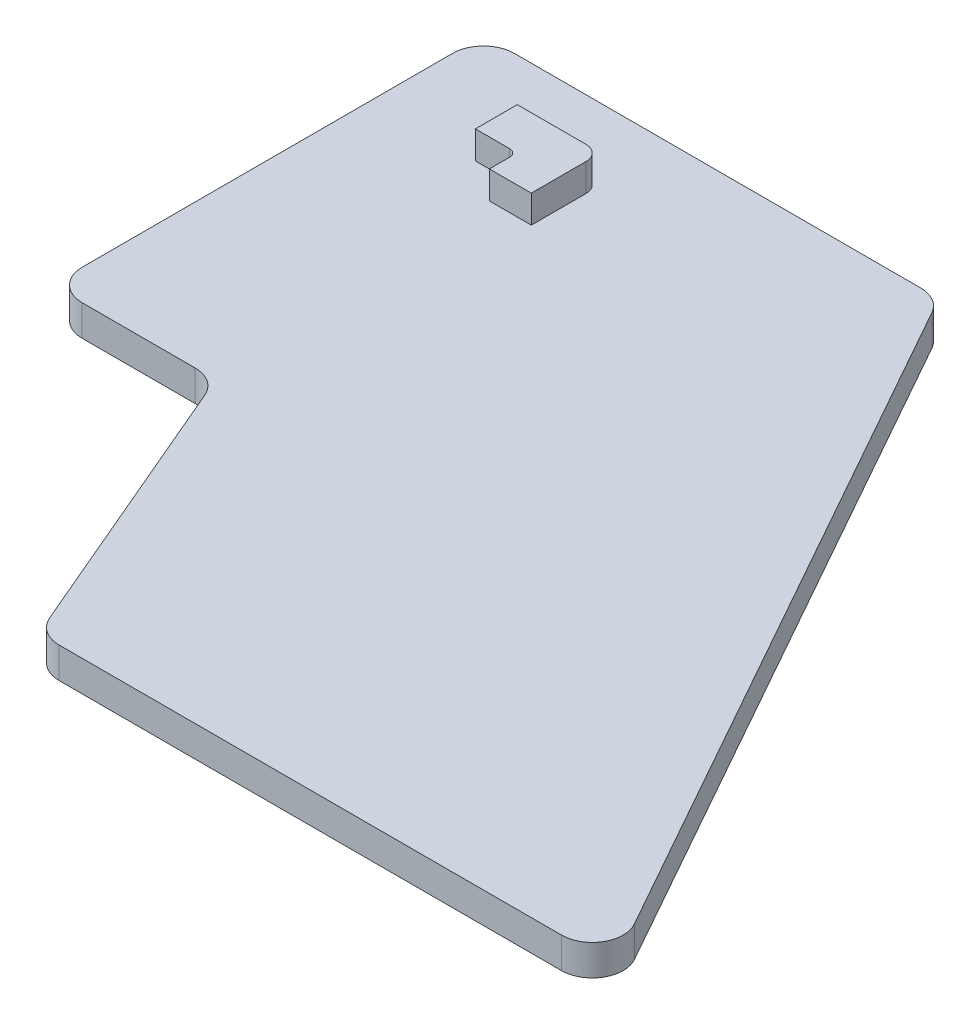
ISO-10303-21;
HEADER;
FILE_DESCRIPTION(('STEP AP214'),'2;1');
FILE_NAME('part.step','',(''),(''),'','','');
FILE_SCHEMA(('AUTOMOTIVE_DESIGN { 1 0 10303 214 1 1 1 1 }'));
ENDSEC;
DATA;
#1=APPLICATION_CONTEXT('core data for automotive mechanical design processes');
#2=APPLICATION_PROTOCOL_DEFINITION('international standard','automotive_design',2000,#1);
#3=PRODUCT_CONTEXT('',#1,'mechanical');
#4=PRODUCT('Part','Part','',(#3));
#5=PRODUCT_RELATED_PRODUCT_CATEGORY('part','',(#4));
#6=PRODUCT_DEFINITION_FORMATION('','',#4);
#7=PRODUCT_DEFINITION_CONTEXT('part definition',#1,'design');
#8=PRODUCT_DEFINITION('design','',#6,#7);
#9=PRODUCT_DEFINITION_SHAPE('','',#8);
#10=(LENGTH_UNIT() NAMED_UNIT(*) SI_UNIT(.MILLI.,.METRE.));
#11=(NAMED_UNIT(*) PLANE_ANGLE_UNIT() SI_UNIT($,.RADIAN.));
#12=(NAMED_UNIT(*) SI_UNIT($,.STERADIAN.) SOLID_ANGLE_UNIT());
#13=UNCERTAINTY_MEASURE_WITH_UNIT(LENGTH_MEASURE(1.E-05),#10,'distance_accuracy_value','');
#14=(GEOMETRIC_REPRESENTATION_CONTEXT(3) GLOBAL_UNCERTAINTY_ASSIGNED_CONTEXT((#13)) GLOBAL_UNIT_ASSIGNED_CONTEXT((#10,
#11,#12)) REPRESENTATION_CONTEXT('',''));
#15=CARTESIAN_POINT('',(0.,0.,0.));
#16=DIRECTION('',(0.,0.,1.));
#17=DIRECTION('',(1.,0.,0.));
#18=AXIS2_PLACEMENT_3D('',#15,#16,#17);
#19=CARTESIAN_POINT('',(45.0474985018765,0.,-41.3328587699317));
#20=DIRECTION('',(0.,-1.,0.));
#21=DIRECTION('',(0.,0.,-1.));
#22=AXIS2_PLACEMENT_3D('',#19,#20,#21);
#23=PLANE('',#22);
#24=CARTESIAN_POINT('',(45.0474985018765,0.,-41.3328587699317));
#25=DIRECTION('',(0.,1.,0.));
#26=DIRECTION('',(0.,0.,-1.));
#27=AXIS2_PLACEMENT_3D('',#24,#25,#26);
#28=CIRCLE('',#27,3.175);
#29=CARTESIAN_POINT('',(47.8161807801542,0.,-42.8868933390295));
#30=VERTEX_POINT('',#29);
#31=CARTESIAN_POINT('',(45.0474985018765,0.,-44.5078587699317));
#32=VERTEX_POINT('',#31);
#33=EDGE_CURVE('E185',#30,#32,#28,.T.);
#34=ORIENTED_EDGE('',*,*,#33,.T.);
#35=DIRECTION('',(-1.,0.,0.));
#36=VECTOR('',#35,1.);
#37=CARTESIAN_POINT('',(3.17500000000002,0.,-44.5078587699317));
#38=LINE('',#37,#36);
#39=CARTESIAN_POINT('',(3.17500000000002,0.,-44.5078587699317));
#40=VERTEX_POINT('',#39);
#41=EDGE_CURVE('E188',#32,#40,#38,.T.);
#42=ORIENTED_EDGE('',*,*,#41,.T.);
#43=CARTESIAN_POINT('',(3.175,0.,-41.3328587699317));
#44=DIRECTION('',(0.,1.,0.));
#45=DIRECTION('',(0.,0.,1.));
#46=AXIS2_PLACEMENT_3D('',#43,#44,#45);
#47=CIRCLE('',#46,3.175);
#48=CARTESIAN_POINT('',(0.,0.,-41.3328587699316));
#49=VERTEX_POINT('',#48);
#50=EDGE_CURVE('E234',#40,#49,#47,.T.);
#51=ORIENTED_EDGE('',*,*,#50,.T.);
#52=DIRECTION('',(0.,0.,1.));
#53=VECTOR('',#52,1.);
#54=CARTESIAN_POINT('',(0.,0.,-3.17500000000002));
#55=LINE('',#54,#53);
#56=CARTESIAN_POINT('',(0.,0.,-3.17500000000002));
#57=VERTEX_POINT('',#56);
#58=EDGE_CURVE('E237',#49,#57,#55,.T.);
#59=ORIENTED_EDGE('',*,*,#58,.T.);
#60=CARTESIAN_POINT('',(3.175,0.,-3.175));
#61=DIRECTION('',(0.,1.,0.));
#62=DIRECTION('',(0.,0.,-1.));
#63=AXIS2_PLACEMENT_3D('',#60,#61,#62);
#64=CIRCLE('',#63,3.175);
#65=CARTESIAN_POINT('',(3.17500000000002,0.,0.));
#66=VERTEX_POINT('',#65);
#67=EDGE_CURVE('E240',#57,#66,#64,.T.);
#68=ORIENTED_EDGE('',*,*,#67,.T.);
#69=DIRECTION('',(1.,0.,0.));
#70=VECTOR('',#69,1.);
#71=CARTESIAN_POINT('',(14.8087254781073,0.,0.));
#72=LINE('',#71,#70);
#73=CARTESIAN_POINT('',(14.8087254781073,0.,0.));
#74=VERTEX_POINT('',#73);
#75=EDGE_CURVE('E243',#66,#74,#72,.T.);
#76=ORIENTED_EDGE('',*,*,#75,.T.);
#77=CARTESIAN_POINT('',(14.8087254781073,0.,3.175));
#78=DIRECTION('',(0.,-1.,0.));
#79=DIRECTION('',(0.,0.,1.));
#80=AXIS2_PLACEMENT_3D('',#77,#78,#79);
#81=CIRCLE('',#80,3.175);
#82=CARTESIAN_POINT('',(17.7293479504936,0.,1.92977336448649));
#83=VERTEX_POINT('',#82);
#84=EDGE_CURVE('E246',#74,#83,#81,.T.);
#85=ORIENTED_EDGE('',*,*,#84,.T.);
#86=DIRECTION('',(0.39219736551607,0.,0.919881093664966));
#87=VECTOR('',#86,1.);
#88=CARTESIAN_POINT('',(29.6082922430003,0.,29.7912972505477));
#89=LINE('',#88,#87);
#90=CARTESIAN_POINT('',(29.6082922430003,0.,29.7912972505477));
#91=VERTEX_POINT('',#90);
#92=EDGE_CURVE('E249',#83,#91,#89,.T.);
#93=ORIENTED_EDGE('',*,*,#92,.T.);
#94=CARTESIAN_POINT('',(32.5289147153866,0.,28.5460706150342));
#95=DIRECTION('',(0.,1.,0.));
#96=DIRECTION('',(0.,0.,-1.));
#97=AXIS2_PLACEMENT_3D('',#94,#95,#96);
#98=CIRCLE('',#97,3.175);
#99=CARTESIAN_POINT('',(32.5289147153866,0.,31.7210706150342));
#100=VERTEX_POINT('',#99);
#101=EDGE_CURVE('E252',#91,#100,#98,.T.);
#102=ORIENTED_EDGE('',*,*,#101,.T.);
#103=DIRECTION('',(1.,0.,0.));
#104=VECTOR('',#103,1.);
#105=CARTESIAN_POINT('',(84.2698653179541,0.,31.7210706150342));
#106=LINE('',#105,#104);
#107=CARTESIAN_POINT('',(84.2698653179541,0.,31.7210706150342));
#108=VERTEX_POINT('',#107);
#109=EDGE_CURVE('E255',#100,#108,#106,.T.);
#110=ORIENTED_EDGE('',*,*,#109,.T.);
#111=CARTESIAN_POINT('',(84.2698653179541,0.,28.5460706150342));
#112=DIRECTION('',(0.,1.,0.));
#113=DIRECTION('',(0.,0.,-1.));
#114=AXIS2_PLACEMENT_3D('',#111,#112,#113);
#115=CIRCLE('',#114,3.175);
#116=CARTESIAN_POINT('',(87.0385475962318,0.,26.9920360459363));
#117=VERTEX_POINT('',#116);
#118=EDGE_CURVE('E258',#108,#117,#115,.T.);
#119=ORIENTED_EDGE('',*,*,#118,.T.);
#120=DIRECTION('',(-0.489459706802458,0.,-0.872025914418173));
#121=VECTOR('',#120,1.);
#122=CARTESIAN_POINT('',(47.8161807801542,0.,-42.8868933390295));
#123=LINE('',#122,#121);
#124=EDGE_CURVE('E198',#117,#30,#123,.T.);
#125=ORIENTED_EDGE('',*,*,#124,.T.);
#126=EDGE_LOOP('',(#34,#42,#51,#59,#68,#76,#85,#93,#102,#110,#119,#125));
#127=FACE_BOUND('',#126,.T.);
#128=DIRECTION('',(0.,0.,-1.));
#129=VECTOR('',#128,1.);
#130=CARTESIAN_POINT('',(19.3785254755301,0.,-41.3328587699317));
#131=LINE('',#130,#129);
#132=CARTESIAN_POINT('',(19.3785254755301,0.,-30.0552376996477));
#133=VERTEX_POINT('',#132);
#134=CARTESIAN_POINT('',(19.3785254755301,0.,-35.7010437054775));
#135=VERTEX_POINT('',#134);
#136=EDGE_CURVE('E11',#133,#135,#131,.T.);
#137=ORIENTED_EDGE('',*,*,#136,.F.);
#138=DIRECTION('',(1.,0.,0.));
#139=VECTOR('',#138,1.);
#140=CARTESIAN_POINT('',(45.0474985018765,0.,-30.0552376996477));
#141=LINE('',#140,#139);
#142=CARTESIAN_POINT('',(15.0618146457595,0.,-30.0552376996477));
#143=VERTEX_POINT('',#142);
#144=EDGE_CURVE('E265',#143,#133,#141,.T.);
#145=ORIENTED_EDGE('',*,*,#144,.F.);
#146=DIRECTION('',(0.,0.,1.));
#147=VECTOR('',#146,1.);
#148=CARTESIAN_POINT('',(15.0618146457595,0.,-41.3328587699317));
#149=LINE('',#148,#147);
#150=CARTESIAN_POINT('',(15.0618146457595,0.,-32.1463328757069));
#151=VERTEX_POINT('',#150);
#152=EDGE_CURVE('E289',#151,#143,#149,.T.);
#153=ORIENTED_EDGE('',*,*,#152,.F.);
#154=CARTESIAN_POINT('',(14.2998146457595,0.,-32.1463328757069));
#155=DIRECTION('',(0.,-1.,0.));
#156=DIRECTION('',(0.,0.,-1.));
#157=AXIS2_PLACEMENT_3D('',#154,#155,#156);
#158=CIRCLE('',#157,0.762000000000001);
#159=CARTESIAN_POINT('',(14.2998146457595,0.,-32.9083328757069));
#160=VERTEX_POINT('',#159);
#161=EDGE_CURVE('E292',#160,#151,#158,.T.);
#162=ORIENTED_EDGE('',*,*,#161,.F.);
#163=DIRECTION('',(1.,0.,0.));
#164=VECTOR('',#163,1.);
#165=CARTESIAN_POINT('',(45.0474985018765,0.,-32.9083328757069));
#166=LINE('',#165,#164);
#167=CARTESIAN_POINT('',(10.7687570976498,0.,-32.9083328757069));
#168=VERTEX_POINT('',#167);
#169=EDGE_CURVE('E295',#168,#160,#166,.T.);
#170=ORIENTED_EDGE('',*,*,#169,.F.);
#171=DIRECTION('',(0.,0.,1.));
#172=VECTOR('',#171,1.);
#173=CARTESIAN_POINT('',(10.7687570976498,0.,-41.3328587699317));
#174=LINE('',#173,#172);
#175=CARTESIAN_POINT('',(10.7687570976498,0.,-37.2250437054775));
#176=VERTEX_POINT('',#175);
#177=EDGE_CURVE('E298',#176,#168,#174,.T.);
#178=ORIENTED_EDGE('',*,*,#177,.F.);
#179=DIRECTION('',(-1.,0.,0.));
#180=VECTOR('',#179,1.);
#181=CARTESIAN_POINT('',(45.0474985018765,0.,-37.2250437054775));
#182=LINE('',#181,#180);
#183=CARTESIAN_POINT('',(17.85452547553,0.,-37.2250437054775));
#184=VERTEX_POINT('',#183);
#185=EDGE_CURVE('E49',#184,#176,#182,.T.);
#186=ORIENTED_EDGE('',*,*,#185,.F.);
#187=CARTESIAN_POINT('',(17.8545254755301,0.,-35.7010437054775));
#188=DIRECTION('',(0.,-1.,0.));
#189=DIRECTION('',(0.,0.,-1.));
#190=AXIS2_PLACEMENT_3D('',#187,#188,#189);
#191=CIRCLE('',#190,1.524);
#192=EDGE_CURVE('E39',#135,#184,#191,.F.);
#193=ORIENTED_EDGE('',*,*,#192,.F.);
#194=EDGE_LOOP('',(#137,#145,#153,#162,#170,#178,#186,#193));
#195=FACE_BOUND('',#194,.T.);
#196=ADVANCED_FACE('F31',(#127,#195),#23,.F.);
#197=CARTESIAN_POINT('',(45.0474985018765,-3.175,-41.3328587699317));
#198=DIRECTION('',(0.,1.,0.));
#199=DIRECTION('',(0.,0.,1.));
#200=AXIS2_PLACEMENT_3D('',#197,#198,#199);
#201=CYLINDRICAL_SURFACE('',#200,3.175);
#202=ORIENTED_EDGE('',*,*,#33,.F.);
#203=DIRECTION('',(0.,1.,0.));
#204=VECTOR('',#203,1.);
#205=CARTESIAN_POINT('',(47.8161807801542,-3.175,-42.8868933390295));
#206=LINE('',#205,#204);
#207=CARTESIAN_POINT('',(47.8161807801542,-3.175,-42.8868933390295));
#208=VERTEX_POINT('',#207);
#209=EDGE_CURVE('E263',#208,#30,#206,.T.);
#210=ORIENTED_EDGE('',*,*,#209,.F.);
#211=CARTESIAN_POINT('',(45.0474985018765,-3.175,-41.3328587699317));
#212=DIRECTION('',(0.,1.,0.));
#213=DIRECTION('',(0.,0.,-1.));
#214=AXIS2_PLACEMENT_3D('',#211,#212,#213);
#215=CIRCLE('',#214,3.175);
#216=CARTESIAN_POINT('',(45.0474985018765,-3.175,-44.5078587699317));
#217=VERTEX_POINT('',#216);
#218=EDGE_CURVE('E194',#208,#217,#215,.T.);
#219=ORIENTED_EDGE('',*,*,#218,.T.);
#220=DIRECTION('',(0.,1.,0.));
#221=VECTOR('',#220,1.);
#222=CARTESIAN_POINT('',(45.0474985018765,-3.175,-44.5078587699317));
#223=LINE('',#222,#221);
#224=EDGE_CURVE('E230',#217,#32,#223,.T.);
#225=ORIENTED_EDGE('',*,*,#224,.T.);
#226=EDGE_LOOP('',(#202,#210,#219,#225));
#227=FACE_BOUND('',#226,.T.);
#228=ADVANCED_FACE('F33',(#227),#201,.T.);
#229=CARTESIAN_POINT('',(47.8161807801542,-3.175,-42.8868933390295));
#230=DIRECTION('',(0.872025914418173,0.,-0.489459706802458));
#231=DIRECTION('',(-0.489459706802458,0.,-0.872025914418173));
#232=AXIS2_PLACEMENT_3D('',#229,#230,#231);
#233=PLANE('',#232);
#234=ORIENTED_EDGE('',*,*,#124,.F.);
#235=DIRECTION('',(0.,1.,0.));
#236=VECTOR('',#235,1.);
#237=CARTESIAN_POINT('',(87.0385475962318,-3.175,26.9920360459363));
#238=LINE('',#237,#236);
#239=CARTESIAN_POINT('',(87.0385475962318,-3.175,26.9920360459363));
#240=VERTEX_POINT('',#239);
#241=EDGE_CURVE('E266',#240,#117,#238,.T.);
#242=ORIENTED_EDGE('',*,*,#241,.F.);
#243=DIRECTION('',(-0.489459706802458,0.,-0.872025914418173));
#244=VECTOR('',#243,1.);
#245=CARTESIAN_POINT('',(47.8161807801542,-3.175,-42.8868933390295));
#246=LINE('',#245,#244);
#247=EDGE_CURVE('E228',#240,#208,#246,.T.);
#248=ORIENTED_EDGE('',*,*,#247,.T.);
#249=ORIENTED_EDGE('',*,*,#209,.T.);
#250=EDGE_LOOP('',(#234,#242,#248,#249));
#251=FACE_BOUND('',#250,.T.);
#252=ADVANCED_FACE('F353',(#251),#233,.T.);
#253=CARTESIAN_POINT('',(84.2698653179541,-3.175,28.5460706150342));
#254=DIRECTION('',(0.,1.,0.));
#255=DIRECTION('',(0.,0.,1.));
#256=AXIS2_PLACEMENT_3D('',#253,#254,#255);
#257=CYLINDRICAL_SURFACE('',#256,3.175);
#258=ORIENTED_EDGE('',*,*,#118,.F.);
#259=DIRECTION('',(0.,1.,0.));
#260=VECTOR('',#259,1.);
#261=CARTESIAN_POINT('',(84.2698653179541,-3.175,31.7210706150342));
#262=LINE('',#261,#260);
#263=CARTESIAN_POINT('',(84.2698653179541,-3.175,31.7210706150342));
#264=VERTEX_POINT('',#263);
#265=EDGE_CURVE('E268',#264,#108,#262,.T.);
#266=ORIENTED_EDGE('',*,*,#265,.F.);
#267=CARTESIAN_POINT('',(84.2698653179541,-3.175,28.5460706150342));
#268=DIRECTION('',(0.,1.,0.));
#269=DIRECTION('',(0.,0.,-1.));
#270=AXIS2_PLACEMENT_3D('',#267,#268,#269);
#271=CIRCLE('',#270,3.175);
#272=EDGE_CURVE('E225',#264,#240,#271,.T.);
#273=ORIENTED_EDGE('',*,*,#272,.T.);
#274=ORIENTED_EDGE('',*,*,#241,.T.);
#275=EDGE_LOOP('',(#258,#266,#273,#274));
#276=FACE_BOUND('',#275,.T.);
#277=ADVANCED_FACE('F361',(#276),#257,.T.);
#278=CARTESIAN_POINT('',(84.2698653179541,-3.175,31.7210706150342));
#279=DIRECTION('',(0.,0.,1.));
#280=DIRECTION('',(1.,0.,0.));
#281=AXIS2_PLACEMENT_3D('',#278,#279,#280);
#282=PLANE('',#281);
#283=ORIENTED_EDGE('',*,*,#109,.F.);
#284=DIRECTION('',(0.,1.,0.));
#285=VECTOR('',#284,1.);
#286=CARTESIAN_POINT('',(32.5289147153866,-3.175,31.7210706150342));
#287=LINE('',#286,#285);
#288=CARTESIAN_POINT('',(32.5289147153866,-3.175,31.7210706150342));
#289=VERTEX_POINT('',#288);
#290=EDGE_CURVE('E270',#289,#100,#287,.T.);
#291=ORIENTED_EDGE('',*,*,#290,.F.);
#292=DIRECTION('',(1.,0.,0.));
#293=VECTOR('',#292,1.);
#294=CARTESIAN_POINT('',(84.2698653179541,-3.175,31.7210706150342));
#295=LINE('',#294,#293);
#296=EDGE_CURVE('E222',#289,#264,#295,.T.);
#297=ORIENTED_EDGE('',*,*,#296,.T.);
#298=ORIENTED_EDGE('',*,*,#265,.T.);
#299=EDGE_LOOP('',(#283,#291,#297,#298));
#300=FACE_BOUND('',#299,.T.);
#301=ADVANCED_FACE('F365',(#300),#282,.T.);
#302=CARTESIAN_POINT('',(32.5289147153866,-3.175,28.5460706150342));
#303=DIRECTION('',(0.,1.,0.));
#304=DIRECTION('',(0.,0.,1.));
#305=AXIS2_PLACEMENT_3D('',#302,#303,#304);
#306=CYLINDRICAL_SURFACE('',#305,3.175);
#307=ORIENTED_EDGE('',*,*,#101,.F.);
#308=DIRECTION('',(0.,1.,0.));
#309=VECTOR('',#308,1.);
#310=CARTESIAN_POINT('',(29.6082922430003,-3.175,29.7912972505477));
#311=LINE('',#310,#309);
#312=CARTESIAN_POINT('',(29.6082922430003,-3.175,29.7912972505477));
#313=VERTEX_POINT('',#312);
#314=EDGE_CURVE('E272',#313,#91,#311,.T.);
#315=ORIENTED_EDGE('',*,*,#314,.F.);
#316=CARTESIAN_POINT('',(32.5289147153866,-3.175,28.5460706150342));
#317=DIRECTION('',(0.,1.,0.));
#318=DIRECTION('',(0.,0.,-1.));
#319=AXIS2_PLACEMENT_3D('',#316,#317,#318);
#320=CIRCLE('',#319,3.175);
#321=EDGE_CURVE('E219',#313,#289,#320,.T.);
#322=ORIENTED_EDGE('',*,*,#321,.T.);
#323=ORIENTED_EDGE('',*,*,#290,.T.);
#324=EDGE_LOOP('',(#307,#315,#322,#323));
#325=FACE_BOUND('',#324,.T.);
#326=ADVANCED_FACE('F369',(#325),#306,.T.);
#327=CARTESIAN_POINT('',(29.6082922430003,-3.175,29.7912972505477));
#328=DIRECTION('',(-0.919881093664966,0.,0.39219736551607));
#329=DIRECTION('',(0.39219736551607,0.,0.919881093664966));
#330=AXIS2_PLACEMENT_3D('',#327,#328,#329);
#331=PLANE('',#330);
#332=ORIENTED_EDGE('',*,*,#92,.F.);
#333=DIRECTION('',(0.,1.,0.));
#334=VECTOR('',#333,1.);
#335=CARTESIAN_POINT('',(17.7293479504936,-3.175,1.92977336448649));
#336=LINE('',#335,#334);
#337=CARTESIAN_POINT('',(17.7293479504936,-3.175,1.92977336448649));
#338=VERTEX_POINT('',#337);
#339=EDGE_CURVE('E274',#338,#83,#336,.T.);
#340=ORIENTED_EDGE('',*,*,#339,.F.);
#341=DIRECTION('',(0.39219736551607,0.,0.919881093664966));
#342=VECTOR('',#341,1.);
#343=CARTESIAN_POINT('',(29.6082922430003,-3.175,29.7912972505477));
#344=LINE('',#343,#342);
#345=EDGE_CURVE('E216',#338,#313,#344,.T.);
#346=ORIENTED_EDGE('',*,*,#345,.T.);
#347=ORIENTED_EDGE('',*,*,#314,.T.);
#348=EDGE_LOOP('',(#332,#340,#346,#347));
#349=FACE_BOUND('',#348,.T.);
#350=ADVANCED_FACE('F373',(#349),#331,.T.);
#351=CARTESIAN_POINT('',(14.8087254781073,-3.175,3.175));
#352=DIRECTION('',(0.,1.,0.));
#353=DIRECTION('',(0.,0.,1.));
#354=AXIS2_PLACEMENT_3D('',#351,#352,#353);
#355=CYLINDRICAL_SURFACE('',#354,3.175);
#356=ORIENTED_EDGE('',*,*,#84,.F.);
#357=DIRECTION('',(0.,1.,0.));
#358=VECTOR('',#357,1.);
#359=CARTESIAN_POINT('',(14.8087254781073,-3.175,0.));
#360=LINE('',#359,#358);
#361=CARTESIAN_POINT('',(14.8087254781073,-3.175,0.));
#362=VERTEX_POINT('',#361);
#363=EDGE_CURVE('E276',#362,#74,#360,.T.);
#364=ORIENTED_EDGE('',*,*,#363,.F.);
#365=CARTESIAN_POINT('',(14.8087254781073,-3.175,3.175));
#366=DIRECTION('',(0.,-1.,0.));
#367=DIRECTION('',(0.,0.,1.));
#368=AXIS2_PLACEMENT_3D('',#365,#366,#367);
#369=CIRCLE('',#368,3.175);
#370=EDGE_CURVE('E213',#362,#338,#369,.T.);
#371=ORIENTED_EDGE('',*,*,#370,.T.);
#372=ORIENTED_EDGE('',*,*,#339,.T.);
#373=EDGE_LOOP('',(#356,#364,#371,#372));
#374=FACE_BOUND('',#373,.T.);
#375=ADVANCED_FACE('F377',(#374),#355,.F.);
#376=CARTESIAN_POINT('',(14.8087254781073,-3.175,0.));
#377=DIRECTION('',(0.,0.,1.));
#378=DIRECTION('',(1.,0.,0.));
#379=AXIS2_PLACEMENT_3D('',#376,#377,#378);
#380=PLANE('',#379);
#381=ORIENTED_EDGE('',*,*,#75,.F.);
#382=DIRECTION('',(0.,1.,0.));
#383=VECTOR('',#382,1.);
#384=CARTESIAN_POINT('',(3.17500000000002,-3.175,0.));
#385=LINE('',#384,#383);
#386=CARTESIAN_POINT('',(3.17500000000002,-3.175,0.));
#387=VERTEX_POINT('',#386);
#388=EDGE_CURVE('E278',#387,#66,#385,.T.);
#389=ORIENTED_EDGE('',*,*,#388,.F.);
#390=DIRECTION('',(1.,0.,0.));
#391=VECTOR('',#390,1.);
#392=CARTESIAN_POINT('',(14.8087254781073,-3.175,0.));
#393=LINE('',#392,#391);
#394=EDGE_CURVE('E210',#387,#362,#393,.T.);
#395=ORIENTED_EDGE('',*,*,#394,.T.);
#396=ORIENTED_EDGE('',*,*,#363,.T.);
#397=EDGE_LOOP('',(#381,#389,#395,#396));
#398=FACE_BOUND('',#397,.T.);
#399=ADVANCED_FACE('F381',(#398),#380,.T.);
#400=CARTESIAN_POINT('',(3.175,-3.175,-3.175));
#401=DIRECTION('',(0.,1.,0.));
#402=DIRECTION('',(0.,0.,1.));
#403=AXIS2_PLACEMENT_3D('',#400,#401,#402);
#404=CYLINDRICAL_SURFACE('',#403,3.175);
#405=ORIENTED_EDGE('',*,*,#67,.F.);
#406=DIRECTION('',(0.,1.,0.));
#407=VECTOR('',#406,1.);
#408=CARTESIAN_POINT('',(0.,-3.175,-3.17500000000002));
#409=LINE('',#408,#407);
#410=CARTESIAN_POINT('',(0.,-3.175,-3.17500000000002));
#411=VERTEX_POINT('',#410);
#412=EDGE_CURVE('E280',#411,#57,#409,.T.);
#413=ORIENTED_EDGE('',*,*,#412,.F.);
#414=CARTESIAN_POINT('',(3.175,-3.175,-3.175));
#415=DIRECTION('',(0.,1.,0.));
#416=DIRECTION('',(0.,0.,-1.));
#417=AXIS2_PLACEMENT_3D('',#414,#415,#416);
#418=CIRCLE('',#417,3.175);
#419=EDGE_CURVE('E207',#411,#387,#418,.T.);
#420=ORIENTED_EDGE('',*,*,#419,.T.);
#421=ORIENTED_EDGE('',*,*,#388,.T.);
#422=EDGE_LOOP('',(#405,#413,#420,#421));
#423=FACE_BOUND('',#422,.T.);
#424=ADVANCED_FACE('F385',(#423),#404,.T.);
#425=CARTESIAN_POINT('',(0.,-3.175,-3.17500000000002));
#426=DIRECTION('',(-1.,0.,0.));
#427=DIRECTION('',(0.,0.,1.));
#428=AXIS2_PLACEMENT_3D('',#425,#426,#427);
#429=PLANE('',#428);
#430=ORIENTED_EDGE('',*,*,#58,.F.);
#431=DIRECTION('',(0.,1.,0.));
#432=VECTOR('',#431,1.);
#433=CARTESIAN_POINT('',(0.,-3.175,-41.3328587699316));
#434=LINE('',#433,#432);
#435=CARTESIAN_POINT('',(0.,-3.175,-41.3328587699316));
#436=VERTEX_POINT('',#435);
#437=EDGE_CURVE('E282',#436,#49,#434,.T.);
#438=ORIENTED_EDGE('',*,*,#437,.F.);
#439=DIRECTION('',(0.,0.,1.));
#440=VECTOR('',#439,1.);
#441=CARTESIAN_POINT('',(0.,-3.175,-3.17500000000002));
#442=LINE('',#441,#440);
#443=EDGE_CURVE('E204',#436,#411,#442,.T.);
#444=ORIENTED_EDGE('',*,*,#443,.T.);
#445=ORIENTED_EDGE('',*,*,#412,.T.);
#446=EDGE_LOOP('',(#430,#438,#444,#445));
#447=FACE_BOUND('',#446,.T.);
#448=ADVANCED_FACE('F389',(#447),#429,.T.);
#449=CARTESIAN_POINT('',(3.175,-3.175,-41.3328587699317));
#450=DIRECTION('',(0.,1.,0.));
#451=DIRECTION('',(0.,0.,1.));
#452=AXIS2_PLACEMENT_3D('',#449,#450,#451);
#453=CYLINDRICAL_SURFACE('',#452,3.175);
#454=ORIENTED_EDGE('',*,*,#50,.F.);
#455=DIRECTION('',(0.,1.,0.));
#456=VECTOR('',#455,1.);
#457=CARTESIAN_POINT('',(3.17500000000002,-3.175,-44.5078587699317));
#458=LINE('',#457,#456);
#459=CARTESIAN_POINT('',(3.17500000000002,-3.175,-44.5078587699317));
#460=VERTEX_POINT('',#459);
#461=EDGE_CURVE('E284',#460,#40,#458,.T.);
#462=ORIENTED_EDGE('',*,*,#461,.F.);
#463=CARTESIAN_POINT('',(3.175,-3.175,-41.3328587699317));
#464=DIRECTION('',(0.,1.,0.));
#465=DIRECTION('',(0.,0.,1.));
#466=AXIS2_PLACEMENT_3D('',#463,#464,#465);
#467=CIRCLE('',#466,3.175);
#468=EDGE_CURVE('E201',#460,#436,#467,.T.);
#469=ORIENTED_EDGE('',*,*,#468,.T.);
#470=ORIENTED_EDGE('',*,*,#437,.T.);
#471=EDGE_LOOP('',(#454,#462,#469,#470));
#472=FACE_BOUND('',#471,.T.);
#473=ADVANCED_FACE('F393',(#472),#453,.T.);
#474=CARTESIAN_POINT('',(3.17500000000002,-3.175,-44.5078587699317));
#475=DIRECTION('',(0.,0.,-1.));
#476=DIRECTION('',(-1.,0.,0.));
#477=AXIS2_PLACEMENT_3D('',#474,#475,#476);
#478=PLANE('',#477);
#479=ORIENTED_EDGE('',*,*,#41,.F.);
#480=ORIENTED_EDGE('',*,*,#224,.F.);
#481=DIRECTION('',(-1.,0.,0.));
#482=VECTOR('',#481,1.);
#483=CARTESIAN_POINT('',(3.17500000000002,-3.175,-44.5078587699317));
#484=LINE('',#483,#482);
#485=EDGE_CURVE('E197',#217,#460,#484,.T.);
#486=ORIENTED_EDGE('',*,*,#485,.T.);
#487=ORIENTED_EDGE('',*,*,#461,.T.);
#488=EDGE_LOOP('',(#479,#480,#486,#487));
#489=FACE_BOUND('',#488,.T.);
#490=ADVANCED_FACE('F396',(#489),#478,.T.);
#491=CARTESIAN_POINT('',(45.0474985018765,-3.175,-41.3328587699317));
#492=DIRECTION('',(0.,-1.,0.));
#493=DIRECTION('',(0.,0.,-1.));
#494=AXIS2_PLACEMENT_3D('',#491,#492,#493);
#495=PLANE('',#494);
#496=ORIENTED_EDGE('',*,*,#218,.F.);
#497=ORIENTED_EDGE('',*,*,#247,.F.);
#498=ORIENTED_EDGE('',*,*,#272,.F.);
#499=ORIENTED_EDGE('',*,*,#296,.F.);
#500=ORIENTED_EDGE('',*,*,#321,.F.);
#501=ORIENTED_EDGE('',*,*,#345,.F.);
#502=ORIENTED_EDGE('',*,*,#370,.F.);
#503=ORIENTED_EDGE('',*,*,#394,.F.);
#504=ORIENTED_EDGE('',*,*,#419,.F.);
#505=ORIENTED_EDGE('',*,*,#443,.F.);
#506=ORIENTED_EDGE('',*,*,#468,.F.);
#507=ORIENTED_EDGE('',*,*,#485,.F.);
#508=EDGE_LOOP('',(#496,#497,#498,#499,#500,#501,#502,#503,#504,#505,#506,#507));
#509=FACE_BOUND('',#508,.T.);
#510=ADVANCED_FACE('F357',(#509),#495,.T.);
#511=CARTESIAN_POINT('',(19.3785254755301,2.8575,-35.7010437054775));
#512=DIRECTION('',(-1.,0.,0.));
#513=DIRECTION('',(0.,0.,1.));
#514=AXIS2_PLACEMENT_3D('',#511,#512,#513);
#515=PLANE('',#514);
#516=DIRECTION('',(0.,-1.,0.));
#517=VECTOR('',#516,1.);
#518=CARTESIAN_POINT('',(19.3785254755301,2.8575,-30.0552376996477));
#519=LINE('',#518,#517);
#520=CARTESIAN_POINT('',(19.3785254755301,2.8575,-30.0552376996477));
#521=VERTEX_POINT('',#520);
#522=EDGE_CURVE('E317',#521,#133,#519,.T.);
#523=ORIENTED_EDGE('',*,*,#522,.T.);
#524=ORIENTED_EDGE('',*,*,#136,.T.);
#525=DIRECTION('',(0.,-1.,0.));
#526=VECTOR('',#525,1.);
#527=CARTESIAN_POINT('',(19.3785254755301,2.8575,-35.7010437054775));
#528=LINE('',#527,#526);
#529=CARTESIAN_POINT('',(19.3785254755301,2.8575,-35.7010437054775));
#530=VERTEX_POINT('',#529);
#531=EDGE_CURVE('E168',#530,#135,#528,.T.);
#532=ORIENTED_EDGE('',*,*,#531,.F.);
#533=DIRECTION('',(0.,0.,-1.));
#534=VECTOR('',#533,1.);
#535=CARTESIAN_POINT('',(19.3785254755301,2.8575,-35.7010437054775));
#536=LINE('',#535,#534);
#537=EDGE_CURVE('E174',#521,#530,#536,.T.);
#538=ORIENTED_EDGE('',*,*,#537,.F.);
#539=EDGE_LOOP('',(#523,#524,#532,#538));
#540=FACE_BOUND('',#539,.T.);
#541=ADVANCED_FACE('F184',(#540),#515,.F.);
#542=CARTESIAN_POINT('',(17.8545254755301,2.8575,-35.7010437054775));
#543=DIRECTION('',(0.,-1.,0.));
#544=DIRECTION('',(0.,0.,-1.));
#545=AXIS2_PLACEMENT_3D('',#542,#543,#544);
#546=CYLINDRICAL_SURFACE('',#545,1.524);
#547=ORIENTED_EDGE('',*,*,#531,.T.);
#548=ORIENTED_EDGE('',*,*,#192,.T.);
#549=DIRECTION('',(0.,-1.,0.));
#550=VECTOR('',#549,1.);
#551=CARTESIAN_POINT('',(17.85452547553,2.8575,-37.2250437054775));
#552=LINE('',#551,#550);
#553=CARTESIAN_POINT('',(17.85452547553,2.8575,-37.2250437054775));
#554=VERTEX_POINT('',#553);
#555=EDGE_CURVE('E170',#554,#184,#552,.T.);
#556=ORIENTED_EDGE('',*,*,#555,.F.);
#557=CARTESIAN_POINT('',(17.8545254755301,2.8575,-35.7010437054775));
#558=DIRECTION('',(0.,1.,0.));
#559=DIRECTION('',(0.,0.,-1.));
#560=AXIS2_PLACEMENT_3D('',#557,#558,#559);
#561=CIRCLE('',#560,1.524);
#562=EDGE_CURVE('E164',#530,#554,#561,.T.);
#563=ORIENTED_EDGE('',*,*,#562,.F.);
#564=EDGE_LOOP('',(#547,#548,#556,#563));
#565=FACE_BOUND('',#564,.T.);
#566=ADVANCED_FACE('F166',(#565),#546,.T.);
#567=CARTESIAN_POINT('',(10.7687570976498,2.8575,-37.2250437054775));
#568=DIRECTION('',(0.,0.,1.));
#569=DIRECTION('',(1.,0.,0.));
#570=AXIS2_PLACEMENT_3D('',#567,#568,#569);
#571=PLANE('',#570);
#572=ORIENTED_EDGE('',*,*,#555,.T.);
#573=ORIENTED_EDGE('',*,*,#185,.T.);
#574=DIRECTION('',(0.,-1.,0.));
#575=VECTOR('',#574,1.);
#576=CARTESIAN_POINT('',(10.7687570976498,2.8575,-37.2250437054775));
#577=LINE('',#576,#575);
#578=CARTESIAN_POINT('',(10.7687570976498,2.8575,-37.2250437054775));
#579=VERTEX_POINT('',#578);
#580=EDGE_CURVE('E190',#579,#176,#577,.T.);
#581=ORIENTED_EDGE('',*,*,#580,.F.);
#582=DIRECTION('',(-1.,0.,0.));
#583=VECTOR('',#582,1.);
#584=CARTESIAN_POINT('',(10.7687570976498,2.8575,-37.2250437054775));
#585=LINE('',#584,#583);
#586=EDGE_CURVE('E173',#554,#579,#585,.T.);
#587=ORIENTED_EDGE('',*,*,#586,.F.);
#588=EDGE_LOOP('',(#572,#573,#581,#587));
#589=FACE_BOUND('',#588,.T.);
#590=ADVANCED_FACE('F302',(#589),#571,.F.);
#591=CARTESIAN_POINT('',(10.7687570976498,2.8575,-37.2250437054775));
#592=DIRECTION('',(1.,0.,0.));
#593=DIRECTION('',(0.,0.,-1.));
#594=AXIS2_PLACEMENT_3D('',#591,#592,#593);
#595=PLANE('',#594);
#596=ORIENTED_EDGE('',*,*,#580,.T.);
#597=ORIENTED_EDGE('',*,*,#177,.T.);
#598=DIRECTION('',(0.,-1.,0.));
#599=VECTOR('',#598,1.);
#600=CARTESIAN_POINT('',(10.7687570976498,2.8575,-32.9083328757069));
#601=LINE('',#600,#599);
#602=CARTESIAN_POINT('',(10.7687570976498,2.8575,-32.9083328757069));
#603=VERTEX_POINT('',#602);
#604=EDGE_CURVE('E328',#603,#168,#601,.T.);
#605=ORIENTED_EDGE('',*,*,#604,.F.);
#606=DIRECTION('',(0.,0.,1.));
#607=VECTOR('',#606,1.);
#608=CARTESIAN_POINT('',(10.7687570976498,2.8575,-37.2250437054775));
#609=LINE('',#608,#607);
#610=EDGE_CURVE('E306',#579,#603,#609,.T.);
#611=ORIENTED_EDGE('',*,*,#610,.F.);
#612=EDGE_LOOP('',(#596,#597,#605,#611));
#613=FACE_BOUND('',#612,.T.);
#614=ADVANCED_FACE('F331',(#613),#595,.F.);
#615=CARTESIAN_POINT('',(14.2998146457595,2.8575,-32.9083328757069));
#616=DIRECTION('',(0.,0.,-1.));
#617=DIRECTION('',(-1.,0.,0.));
#618=AXIS2_PLACEMENT_3D('',#615,#616,#617);
#619=PLANE('',#618);
#620=ORIENTED_EDGE('',*,*,#604,.T.);
#621=ORIENTED_EDGE('',*,*,#169,.T.);
#622=DIRECTION('',(0.,-1.,0.));
#623=VECTOR('',#622,1.);
#624=CARTESIAN_POINT('',(14.2998146457595,2.8575,-32.9083328757069));
#625=LINE('',#624,#623);
#626=CARTESIAN_POINT('',(14.2998146457595,2.8575,-32.9083328757069));
#627=VERTEX_POINT('',#626);
#628=EDGE_CURVE('E325',#627,#160,#625,.T.);
#629=ORIENTED_EDGE('',*,*,#628,.F.);
#630=DIRECTION('',(1.,0.,0.));
#631=VECTOR('',#630,1.);
#632=CARTESIAN_POINT('',(14.2998146457595,2.8575,-32.9083328757069));
#633=LINE('',#632,#631);
#634=EDGE_CURVE('E308',#603,#627,#633,.T.);
#635=ORIENTED_EDGE('',*,*,#634,.F.);
#636=EDGE_LOOP('',(#620,#621,#629,#635));
#637=FACE_BOUND('',#636,.T.);
#638=ADVANCED_FACE('F338',(#637),#619,.F.);
#639=CARTESIAN_POINT('',(14.2998146457595,2.8575,-32.1463328757069));
#640=DIRECTION('',(0.,-1.,0.));
#641=DIRECTION('',(0.,0.,-1.));
#642=AXIS2_PLACEMENT_3D('',#639,#640,#641);
#643=CYLINDRICAL_SURFACE('',#642,0.762000000000001);
#644=ORIENTED_EDGE('',*,*,#628,.T.);
#645=ORIENTED_EDGE('',*,*,#161,.T.);
#646=DIRECTION('',(0.,-1.,0.));
#647=VECTOR('',#646,1.);
#648=CARTESIAN_POINT('',(15.0618146457595,2.8575,-32.1463328757069));
#649=LINE('',#648,#647);
#650=CARTESIAN_POINT('',(15.0618146457595,2.8575,-32.1463328757069));
#651=VERTEX_POINT('',#650);
#652=EDGE_CURVE('E322',#651,#151,#649,.T.);
#653=ORIENTED_EDGE('',*,*,#652,.F.);
#654=CARTESIAN_POINT('',(14.2998146457595,2.8575,-32.1463328757069));
#655=DIRECTION('',(0.,-1.,0.));
#656=DIRECTION('',(0.,0.,1.));
#657=AXIS2_PLACEMENT_3D('',#654,#655,#656);
#658=CIRCLE('',#657,0.762000000000001);
#659=EDGE_CURVE('E312',#627,#651,#658,.T.);
#660=ORIENTED_EDGE('',*,*,#659,.F.);
#661=EDGE_LOOP('',(#644,#645,#653,#660));
#662=FACE_BOUND('',#661,.T.);
#663=ADVANCED_FACE('F340',(#662),#643,.F.);
#664=CARTESIAN_POINT('',(15.0618146457595,2.8575,-32.1463328757069));
#665=DIRECTION('',(1.,0.,0.));
#666=DIRECTION('',(0.,0.,-1.));
#667=AXIS2_PLACEMENT_3D('',#664,#665,#666);
#668=PLANE('',#667);
#669=ORIENTED_EDGE('',*,*,#652,.T.);
#670=ORIENTED_EDGE('',*,*,#152,.T.);
#671=DIRECTION('',(0.,-1.,0.));
#672=VECTOR('',#671,1.);
#673=CARTESIAN_POINT('',(15.0618146457595,2.8575,-30.0552376996477));
#674=LINE('',#673,#672);
#675=CARTESIAN_POINT('',(15.0618146457595,2.8575,-30.0552376996477));
#676=VERTEX_POINT('',#675);
#677=EDGE_CURVE('E319',#676,#143,#674,.T.);
#678=ORIENTED_EDGE('',*,*,#677,.F.);
#679=DIRECTION('',(0.,0.,1.));
#680=VECTOR('',#679,1.);
#681=CARTESIAN_POINT('',(15.0618146457595,2.8575,-32.1463328757069));
#682=LINE('',#681,#680);
#683=EDGE_CURVE('E314',#651,#676,#682,.T.);
#684=ORIENTED_EDGE('',*,*,#683,.F.);
#685=EDGE_LOOP('',(#669,#670,#678,#684));
#686=FACE_BOUND('',#685,.T.);
#687=ADVANCED_FACE('F344',(#686),#668,.F.);
#688=CARTESIAN_POINT('',(15.0618146457595,2.8575,-30.0552376996477));
#689=DIRECTION('',(0.,0.,-1.));
#690=DIRECTION('',(-1.,0.,0.));
#691=AXIS2_PLACEMENT_3D('',#688,#689,#690);
#692=PLANE('',#691);
#693=ORIENTED_EDGE('',*,*,#677,.T.);
#694=ORIENTED_EDGE('',*,*,#144,.T.);
#695=ORIENTED_EDGE('',*,*,#522,.F.);
#696=DIRECTION('',(1.,0.,0.));
#697=VECTOR('',#696,1.);
#698=CARTESIAN_POINT('',(15.0618146457595,2.8575,-30.0552376996477));
#699=LINE('',#698,#697);
#700=EDGE_CURVE('E179',#676,#521,#699,.T.);
#701=ORIENTED_EDGE('',*,*,#700,.F.);
#702=EDGE_LOOP('',(#693,#694,#695,#701));
#703=FACE_BOUND('',#702,.T.);
#704=ADVANCED_FACE('F346',(#703),#692,.F.);
#705=CARTESIAN_POINT('',(14.2998146457595,2.8575,-32.1463328757069));
#706=DIRECTION('',(0.,1.,0.));
#707=DIRECTION('',(0.,0.,1.));
#708=AXIS2_PLACEMENT_3D('',#705,#706,#707);
#709=PLANE('',#708);
#710=ORIENTED_EDGE('',*,*,#537,.T.);
#711=ORIENTED_EDGE('',*,*,#562,.T.);
#712=ORIENTED_EDGE('',*,*,#586,.T.);
#713=ORIENTED_EDGE('',*,*,#610,.T.);
#714=ORIENTED_EDGE('',*,*,#634,.T.);
#715=ORIENTED_EDGE('',*,*,#659,.T.);
#716=ORIENTED_EDGE('',*,*,#683,.T.);
#717=ORIENTED_EDGE('',*,*,#700,.T.);
#718=EDGE_LOOP('',(#710,#711,#712,#713,#714,#715,#716,#717));
#719=FACE_BOUND('',#718,.T.);
#720=ADVANCED_FACE('F177',(#719),#709,.T.);
#721=CLOSED_SHELL('',(#196,#228,#252,#277,#301,#326,#350,#375,#399,#424,#448,#473,#490,#510,
#541,#566,#590,#614,#638,#663,#687,#704,#720));
#722=MANIFOLD_SOLID_BREP('B2',#721);
#723=ADVANCED_BREP_SHAPE_REPRESENTATION('',(#18,#722),#14);
#724=SHAPE_DEFINITION_REPRESENTATION(#9,#723);
ENDSEC;
END-ISO-10303-21;
